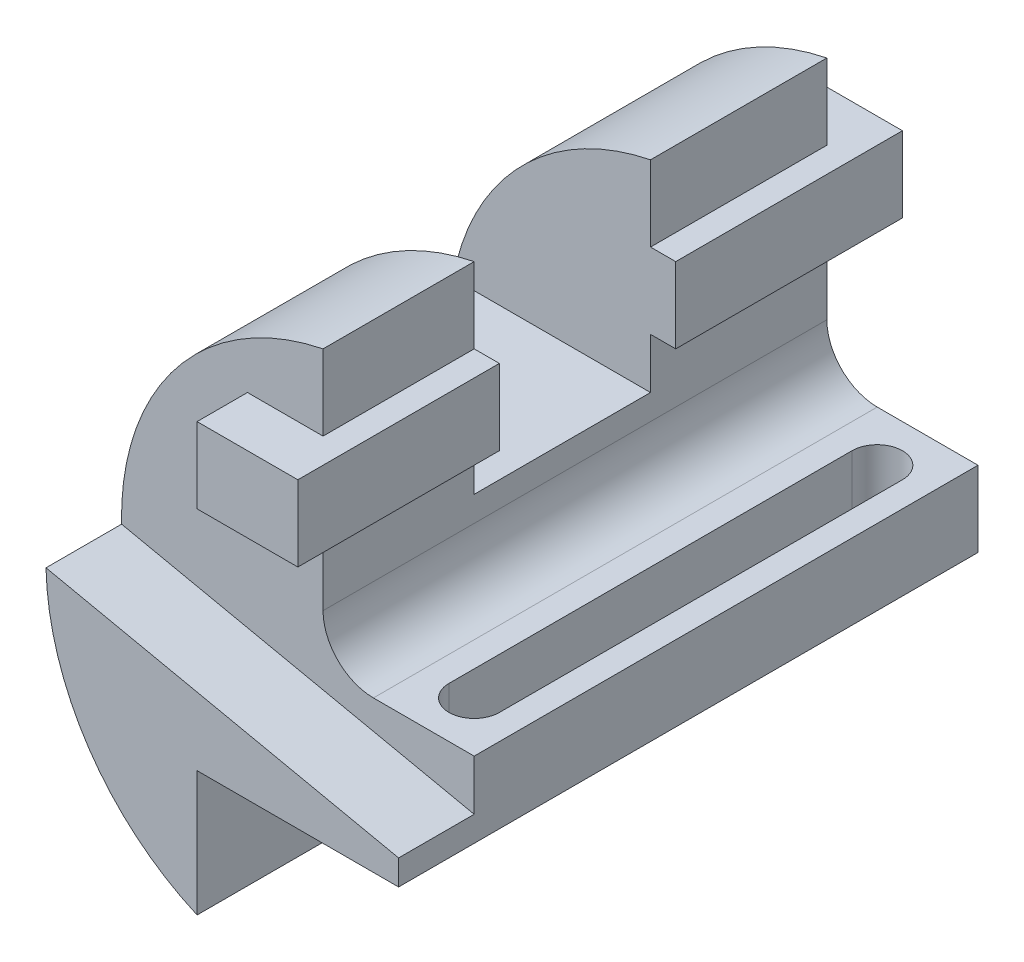
ISO-10303-21;
HEADER;
FILE_DESCRIPTION(('STEP AP214'),'2;1');
FILE_NAME('part.step','',(''),(''),'','','');
FILE_SCHEMA(('AUTOMOTIVE_DESIGN { 1 0 10303 214 1 1 1 1 }'));
ENDSEC;
DATA;
#1=APPLICATION_CONTEXT('core data for automotive mechanical design processes');
#2=APPLICATION_PROTOCOL_DEFINITION('international standard','automotive_design',2000,#1);
#3=PRODUCT_CONTEXT('',#1,'mechanical');
#4=PRODUCT('Part','Part','',(#3));
#5=PRODUCT_RELATED_PRODUCT_CATEGORY('part','',(#4));
#6=PRODUCT_DEFINITION_FORMATION('','',#4);
#7=PRODUCT_DEFINITION_CONTEXT('part definition',#1,'design');
#8=PRODUCT_DEFINITION('design','',#6,#7);
#9=PRODUCT_DEFINITION_SHAPE('','',#8);
#10=(LENGTH_UNIT() NAMED_UNIT(*) SI_UNIT(.MILLI.,.METRE.));
#11=(NAMED_UNIT(*) PLANE_ANGLE_UNIT() SI_UNIT($,.RADIAN.));
#12=(NAMED_UNIT(*) SI_UNIT($,.STERADIAN.) SOLID_ANGLE_UNIT());
#13=UNCERTAINTY_MEASURE_WITH_UNIT(LENGTH_MEASURE(1.E-05),#10,'distance_accuracy_value','');
#14=(GEOMETRIC_REPRESENTATION_CONTEXT(3) GLOBAL_UNCERTAINTY_ASSIGNED_CONTEXT((#13)) GLOBAL_UNIT_ASSIGNED_CONTEXT((#10,
#11,#12)) REPRESENTATION_CONTEXT('',''));
#15=CARTESIAN_POINT('',(0.,0.,0.));
#16=DIRECTION('',(0.,0.,1.));
#17=DIRECTION('',(1.,0.,0.));
#18=AXIS2_PLACEMENT_3D('',#15,#16,#17);
#19=CARTESIAN_POINT('',(-30.,15.,115.));
#20=DIRECTION('',(-1.,0.,0.));
#21=DIRECTION('',(0.,-1.,0.));
#22=AXIS2_PLACEMENT_3D('',#19,#20,#21);
#23=PLANE('',#22);
#24=DIRECTION('',(0.,0.,1.));
#25=VECTOR('',#24,1.);
#26=CARTESIAN_POINT('',(-30.,55.,115.));
#27=LINE('',#26,#25);
#28=CARTESIAN_POINT('',(-30.,55.,70.));
#29=VERTEX_POINT('',#28);
#30=CARTESIAN_POINT('',(-30.,55.,100.));
#31=VERTEX_POINT('',#30);
#32=EDGE_CURVE('E336',#29,#31,#27,.T.);
#33=ORIENTED_EDGE('',*,*,#32,.F.);
#34=DIRECTION('',(0.,1.,0.));
#35=VECTOR('',#34,1.);
#36=CARTESIAN_POINT('',(-30.,15.,70.));
#37=LINE('',#36,#35);
#38=CARTESIAN_POINT('',(-30.,70.,70.));
#39=VERTEX_POINT('',#38);
#40=EDGE_CURVE('E287',#29,#39,#37,.T.);
#41=ORIENTED_EDGE('',*,*,#40,.T.);
#42=DIRECTION('',(0.,0.,-1.));
#43=VECTOR('',#42,1.);
#44=CARTESIAN_POINT('',(-30.,70.,115.));
#45=LINE('',#44,#43);
#46=CARTESIAN_POINT('',(-30.,70.,100.));
#47=VERTEX_POINT('',#46);
#48=EDGE_CURVE('E401',#47,#39,#45,.T.);
#49=ORIENTED_EDGE('',*,*,#48,.F.);
#50=DIRECTION('',(0.,1.,0.));
#51=VECTOR('',#50,1.);
#52=CARTESIAN_POINT('',(-30.,15.,100.));
#53=LINE('',#52,#51);
#54=EDGE_CURVE('E355',#31,#47,#53,.T.);
#55=ORIENTED_EDGE('',*,*,#54,.F.);
#56=EDGE_LOOP('',(#33,#41,#49,#55));
#57=FACE_BOUND('',#56,.T.);
#58=ADVANCED_FACE('F41',(#57),#23,.F.);
#59=CARTESIAN_POINT('',(-25.,40.,-10.));
#60=DIRECTION('',(0.,1.,0.));
#61=DIRECTION('',(-1.,0.,0.));
#62=AXIS2_PLACEMENT_3D('',#59,#60,#61);
#63=PLANE('',#62);
#64=DIRECTION('',(0.,0.,-1.));
#65=VECTOR('',#64,1.);
#66=CARTESIAN_POINT('',(-30.,40.,115.));
#67=LINE('',#66,#65);
#68=CARTESIAN_POINT('',(-30.,40.,100.));
#69=VERTEX_POINT('',#68);
#70=CARTESIAN_POINT('',(-30.,40.,70.));
#71=VERTEX_POINT('',#70);
#72=EDGE_CURVE('E345',#69,#71,#67,.T.);
#73=ORIENTED_EDGE('',*,*,#72,.T.);
#74=DIRECTION('',(1.,0.,0.));
#75=VECTOR('',#74,1.);
#76=CARTESIAN_POINT('',(-25.,40.,70.));
#77=LINE('',#76,#75);
#78=CARTESIAN_POINT('',(-25.,40.,70.));
#79=VERTEX_POINT('',#78);
#80=EDGE_CURVE('E284',#71,#79,#77,.T.);
#81=ORIENTED_EDGE('',*,*,#80,.T.);
#82=DIRECTION('',(0.,0.,1.));
#83=VECTOR('',#82,1.);
#84=CARTESIAN_POINT('',(-25.,40.,-10.));
#85=LINE('',#84,#83);
#86=CARTESIAN_POINT('',(-25.,40.,110.));
#87=VERTEX_POINT('',#86);
#88=EDGE_CURVE('E332',#79,#87,#85,.T.);
#89=ORIENTED_EDGE('',*,*,#88,.T.);
#90=DIRECTION('',(-1.,0.,0.));
#91=VECTOR('',#90,1.);
#92=CARTESIAN_POINT('',(-25.,40.,110.));
#93=LINE('',#92,#91);
#94=CARTESIAN_POINT('',(-45.,40.,110.));
#95=VERTEX_POINT('',#94);
#96=EDGE_CURVE('E299',#87,#95,#93,.T.);
#97=ORIENTED_EDGE('',*,*,#96,.T.);
#98=DIRECTION('',(0.,0.,1.));
#99=VECTOR('',#98,1.);
#100=CARTESIAN_POINT('',(-45.,40.,-10.));
#101=LINE('',#100,#99);
#102=CARTESIAN_POINT('',(-45.,40.,100.));
#103=VERTEX_POINT('',#102);
#104=EDGE_CURVE('E328',#103,#95,#101,.T.);
#105=ORIENTED_EDGE('',*,*,#104,.F.);
#106=DIRECTION('',(-1.,0.,0.));
#107=VECTOR('',#106,1.);
#108=CARTESIAN_POINT('',(-20.,40.,100.));
#109=LINE('',#108,#107);
#110=EDGE_CURVE('E415',#69,#103,#109,.T.);
#111=ORIENTED_EDGE('',*,*,#110,.F.);
#112=EDGE_LOOP('',(#73,#81,#89,#97,#105,#111));
#113=FACE_BOUND('',#112,.T.);
#114=ADVANCED_FACE('F511',(#113),#63,.F.);
#115=CARTESIAN_POINT('',(-25.,55.,-10.));
#116=DIRECTION('',(0.,-1.,0.));
#117=DIRECTION('',(0.,0.,-1.));
#118=AXIS2_PLACEMENT_3D('',#115,#116,#117);
#119=PLANE('',#118);
#120=DIRECTION('',(0.,0.,1.));
#121=VECTOR('',#120,1.);
#122=CARTESIAN_POINT('',(-25.,55.,-10.));
#123=LINE('',#122,#121);
#124=CARTESIAN_POINT('',(-25.,55.,70.));
#125=VERTEX_POINT('',#124);
#126=CARTESIAN_POINT('',(-25.,55.,110.));
#127=VERTEX_POINT('',#126);
#128=EDGE_CURVE('E320',#125,#127,#123,.T.);
#129=ORIENTED_EDGE('',*,*,#128,.F.);
#130=DIRECTION('',(-1.,0.,0.));
#131=VECTOR('',#130,1.);
#132=CARTESIAN_POINT('',(-25.,55.,70.));
#133=LINE('',#132,#131);
#134=EDGE_CURVE('E281',#125,#29,#133,.T.);
#135=ORIENTED_EDGE('',*,*,#134,.T.);
#136=ORIENTED_EDGE('',*,*,#32,.T.);
#137=DIRECTION('',(1.,0.,0.));
#138=VECTOR('',#137,1.);
#139=CARTESIAN_POINT('',(-20.,55.,100.));
#140=LINE('',#139,#138);
#141=CARTESIAN_POINT('',(-45.,55.,100.));
#142=VERTEX_POINT('',#141);
#143=EDGE_CURVE('E409',#142,#31,#140,.T.);
#144=ORIENTED_EDGE('',*,*,#143,.F.);
#145=DIRECTION('',(0.,0.,1.));
#146=VECTOR('',#145,1.);
#147=CARTESIAN_POINT('',(-45.,55.,-10.));
#148=LINE('',#147,#146);
#149=CARTESIAN_POINT('',(-45.,55.,110.));
#150=VERTEX_POINT('',#149);
#151=EDGE_CURVE('E324',#142,#150,#148,.T.);
#152=ORIENTED_EDGE('',*,*,#151,.T.);
#153=DIRECTION('',(1.,0.,0.));
#154=VECTOR('',#153,1.);
#155=CARTESIAN_POINT('',(-25.,55.,110.));
#156=LINE('',#155,#154);
#157=EDGE_CURVE('E307',#150,#127,#156,.T.);
#158=ORIENTED_EDGE('',*,*,#157,.T.);
#159=EDGE_LOOP('',(#129,#135,#136,#144,#152,#158));
#160=FACE_BOUND('',#159,.T.);
#161=ADVANCED_FACE('F517',(#160),#119,.F.);
#162=CARTESIAN_POINT('',(-25.,55.,-10.));
#163=DIRECTION('',(-1.,0.,0.));
#164=DIRECTION('',(0.,-1.,0.));
#165=AXIS2_PLACEMENT_3D('',#162,#163,#164);
#166=PLANE('',#165);
#167=ORIENTED_EDGE('',*,*,#88,.F.);
#168=DIRECTION('',(0.,1.,0.));
#169=VECTOR('',#168,1.);
#170=CARTESIAN_POINT('',(-25.,55.,70.));
#171=LINE('',#170,#169);
#172=EDGE_CURVE('E421',#79,#125,#171,.T.);
#173=ORIENTED_EDGE('',*,*,#172,.T.);
#174=ORIENTED_EDGE('',*,*,#128,.T.);
#175=DIRECTION('',(0.,-1.,0.));
#176=VECTOR('',#175,1.);
#177=CARTESIAN_POINT('',(-25.,55.,110.));
#178=LINE('',#177,#176);
#179=EDGE_CURVE('E303',#127,#87,#178,.T.);
#180=ORIENTED_EDGE('',*,*,#179,.T.);
#181=EDGE_LOOP('',(#167,#173,#174,#180));
#182=FACE_BOUND('',#181,.T.);
#183=ADVANCED_FACE('F525',(#182),#166,.F.);
#184=CARTESIAN_POINT('',(-30.,25.,100.));
#185=VERTEX_POINT('',#184);
#186=EDGE_CURVE('E356',#185,#69,#53,.T.);
#187=ORIENTED_EDGE('',*,*,#186,.F.);
#188=DIRECTION('',(0.,0.,-1.));
#189=VECTOR('',#188,1.);
#190=CARTESIAN_POINT('',(-30.,25.,0.));
#191=LINE('',#190,#189);
#192=CARTESIAN_POINT('',(-30.,25.,0.));
#193=VERTEX_POINT('',#192);
#194=EDGE_CURVE('E436',#185,#193,#191,.T.);
#195=ORIENTED_EDGE('',*,*,#194,.T.);
#196=DIRECTION('',(0.,1.,0.));
#197=VECTOR('',#196,1.);
#198=CARTESIAN_POINT('',(-30.,15.,0.));
#199=LINE('',#198,#197);
#200=CARTESIAN_POINT('',(-30.,40.,0.));
#201=VERTEX_POINT('',#200);
#202=EDGE_CURVE('E390',#193,#201,#199,.T.);
#203=ORIENTED_EDGE('',*,*,#202,.T.);
#204=CARTESIAN_POINT('',(-30.,40.,35.));
#205=VERTEX_POINT('',#204);
#206=EDGE_CURVE('E344',#205,#201,#67,.T.);
#207=ORIENTED_EDGE('',*,*,#206,.F.);
#208=DIRECTION('',(0.,-1.,0.));
#209=VECTOR('',#208,1.);
#210=CARTESIAN_POINT('',(-30.,15.,35.));
#211=LINE('',#210,#209);
#212=CARTESIAN_POINT('',(-30.,30.,35.));
#213=VERTEX_POINT('',#212);
#214=EDGE_CURVE('E275',#205,#213,#211,.T.);
#215=ORIENTED_EDGE('',*,*,#214,.T.);
#216=DIRECTION('',(0.,0.,1.));
#217=VECTOR('',#216,1.);
#218=CARTESIAN_POINT('',(-30.,30.,115.));
#219=LINE('',#218,#217);
#220=CARTESIAN_POINT('',(-30.,30.,70.));
#221=VERTEX_POINT('',#220);
#222=EDGE_CURVE('E296',#213,#221,#219,.T.);
#223=ORIENTED_EDGE('',*,*,#222,.T.);
#224=DIRECTION('',(0.,1.,0.));
#225=VECTOR('',#224,1.);
#226=CARTESIAN_POINT('',(-30.,15.,70.));
#227=LINE('',#226,#225);
#228=EDGE_CURVE('E290',#221,#71,#227,.T.);
#229=ORIENTED_EDGE('',*,*,#228,.T.);
#230=ORIENTED_EDGE('',*,*,#72,.F.);
#231=EDGE_LOOP('',(#187,#195,#203,#207,#215,#223,#229,#230));
#232=FACE_BOUND('',#231,.T.);
#233=ADVANCED_FACE('F442',(#232),#23,.F.);
#234=CARTESIAN_POINT('',(-30.,70.,35.));
#235=VERTEX_POINT('',#234);
#236=CARTESIAN_POINT('',(-30.,70.,0.));
#237=VERTEX_POINT('',#236);
#238=EDGE_CURVE('E400',#235,#237,#45,.T.);
#239=ORIENTED_EDGE('',*,*,#238,.F.);
#240=DIRECTION('',(0.,-1.,0.));
#241=VECTOR('',#240,1.);
#242=CARTESIAN_POINT('',(-30.,15.,35.));
#243=LINE('',#242,#241);
#244=CARTESIAN_POINT('',(-30.,55.,35.));
#245=VERTEX_POINT('',#244);
#246=EDGE_CURVE('E272',#235,#245,#243,.T.);
#247=ORIENTED_EDGE('',*,*,#246,.T.);
#248=CARTESIAN_POINT('',(-30.,55.,0.));
#249=VERTEX_POINT('',#248);
#250=EDGE_CURVE('E337',#249,#245,#27,.T.);
#251=ORIENTED_EDGE('',*,*,#250,.F.);
#252=EDGE_CURVE('E389',#249,#237,#199,.T.);
#253=ORIENTED_EDGE('',*,*,#252,.T.);
#254=EDGE_LOOP('',(#239,#247,#251,#253));
#255=FACE_BOUND('',#254,.T.);
#256=ADVANCED_FACE('F476',(#255),#23,.F.);
#257=CARTESIAN_POINT('',(-20.,21.0102051443364,0.));
#258=DIRECTION('',(0.,0.,1.));
#259=DIRECTION('',(1.,0.,0.));
#260=AXIS2_PLACEMENT_3D('',#257,#258,#259);
#261=PLANE('',#260);
#262=DIRECTION('',(-1.,0.,0.));
#263=VECTOR('',#262,1.);
#264=CARTESIAN_POINT('',(-20.,40.,0.));
#265=LINE('',#264,#263);
#266=CARTESIAN_POINT('',(-45.,40.,0.));
#267=VERTEX_POINT('',#266);
#268=EDGE_CURVE('E348',#201,#267,#265,.T.);
#269=ORIENTED_EDGE('',*,*,#268,.F.);
#270=ORIENTED_EDGE('',*,*,#202,.F.);
#271=CARTESIAN_POINT('',(-20.,25.,0.));
#272=DIRECTION('',(0.,0.,1.));
#273=DIRECTION('',(1.,0.,0.));
#274=AXIS2_PLACEMENT_3D('',#271,#272,#273);
#275=CIRCLE('',#274,10.);
#276=CARTESIAN_POINT('',(-20.,15.,0.));
#277=VERTEX_POINT('',#276);
#278=EDGE_CURVE('E49',#193,#277,#275,.T.);
#279=ORIENTED_EDGE('',*,*,#278,.T.);
#280=DIRECTION('',(-1.,0.,0.));
#281=VECTOR('',#280,1.);
#282=CARTESIAN_POINT('',(0.,15.,0.));
#283=LINE('',#282,#281);
#284=CARTESIAN_POINT('',(0.,15.,0.));
#285=VERTEX_POINT('',#284);
#286=EDGE_CURVE('E387',#285,#277,#283,.T.);
#287=ORIENTED_EDGE('',*,*,#286,.F.);
#288=DIRECTION('',(0.,1.,0.));
#289=VECTOR('',#288,1.);
#290=CARTESIAN_POINT('',(0.,0.,0.));
#291=LINE('',#290,#289);
#292=CARTESIAN_POINT('',(0.,0.,0.));
#293=VERTEX_POINT('',#292);
#294=EDGE_CURVE('E384',#293,#285,#291,.T.);
#295=ORIENTED_EDGE('',*,*,#294,.F.);
#296=DIRECTION('',(1.,0.,0.));
#297=VECTOR('',#296,1.);
#298=CARTESIAN_POINT('',(0.,0.,0.));
#299=LINE('',#298,#297);
#300=CARTESIAN_POINT('',(-40.,0.,0.));
#301=VERTEX_POINT('',#300);
#302=EDGE_CURVE('E368',#301,#293,#299,.T.);
#303=ORIENTED_EDGE('',*,*,#302,.F.);
#304=DIRECTION('',(0.,1.,0.));
#305=VECTOR('',#304,1.);
#306=CARTESIAN_POINT('',(-40.,0.,0.));
#307=LINE('',#306,#305);
#308=CARTESIAN_POINT('',(-40.,-24.8155518052219,0.));
#309=VERTEX_POINT('',#308);
#310=EDGE_CURVE('E374',#309,#301,#307,.T.);
#311=ORIENTED_EDGE('',*,*,#310,.F.);
#312=CARTESIAN_POINT('',(-20.,21.0102051443364,0.));
#313=DIRECTION('',(0.,0.,1.));
#314=DIRECTION('',(1.,0.,0.));
#315=AXIS2_PLACEMENT_3D('',#312,#313,#314);
#316=CIRCLE('',#315,50.);
#317=EDGE_CURVE('E392',#237,#309,#316,.T.);
#318=ORIENTED_EDGE('',*,*,#317,.F.);
#319=ORIENTED_EDGE('',*,*,#252,.F.);
#320=DIRECTION('',(1.,0.,0.));
#321=VECTOR('',#320,1.);
#322=CARTESIAN_POINT('',(-20.,55.,0.));
#323=LINE('',#322,#321);
#324=CARTESIAN_POINT('',(-45.,55.,0.));
#325=VERTEX_POINT('',#324);
#326=EDGE_CURVE('E340',#325,#249,#323,.T.);
#327=ORIENTED_EDGE('',*,*,#326,.F.);
#328=DIRECTION('',(0.,1.,0.));
#329=VECTOR('',#328,1.);
#330=CARTESIAN_POINT('',(-45.,21.0102051443365,0.));
#331=LINE('',#330,#329);
#332=EDGE_CURVE('E342',#267,#325,#331,.T.);
#333=ORIENTED_EDGE('',*,*,#332,.F.);
#334=EDGE_LOOP('',(#269,#270,#279,#287,#295,#303,#311,#318,#319,#327,#333));
#335=FACE_BOUND('',#334,.T.);
#336=ADVANCED_FACE('F449',(#335),#261,.F.);
#337=CARTESIAN_POINT('',(-20.,21.0102051443364,100.));
#338=DIRECTION('',(0.,0.,1.));
#339=DIRECTION('',(1.,0.,0.));
#340=AXIS2_PLACEMENT_3D('',#337,#338,#339);
#341=PLANE('',#340);
#342=DIRECTION('',(-1.,0.,0.));
#343=VECTOR('',#342,1.);
#344=CARTESIAN_POINT('',(0.,15.,100.));
#345=LINE('',#344,#343);
#346=CARTESIAN_POINT('',(0.,15.,100.));
#347=VERTEX_POINT('',#346);
#348=CARTESIAN_POINT('',(-20.,15.,100.));
#349=VERTEX_POINT('',#348);
#350=EDGE_CURVE('E353',#347,#349,#345,.T.);
#351=ORIENTED_EDGE('',*,*,#350,.T.);
#352=CARTESIAN_POINT('',(-20.,25.,100.));
#353=DIRECTION('',(0.,0.,1.));
#354=DIRECTION('',(1.,0.,0.));
#355=AXIS2_PLACEMENT_3D('',#352,#353,#354);
#356=CIRCLE('',#355,10.);
#357=EDGE_CURVE('E12',#349,#185,#356,.F.);
#358=ORIENTED_EDGE('',*,*,#357,.T.);
#359=ORIENTED_EDGE('',*,*,#186,.T.);
#360=ORIENTED_EDGE('',*,*,#110,.T.);
#361=DIRECTION('',(0.,1.,0.));
#362=VECTOR('',#361,1.);
#363=CARTESIAN_POINT('',(-45.,21.0102051443365,100.));
#364=LINE('',#363,#362);
#365=EDGE_CURVE('E412',#103,#142,#364,.T.);
#366=ORIENTED_EDGE('',*,*,#365,.T.);
#367=ORIENTED_EDGE('',*,*,#143,.T.);
#368=ORIENTED_EDGE('',*,*,#54,.T.);
#369=CARTESIAN_POINT('',(-20.,21.0102051443364,100.));
#370=DIRECTION('',(0.,0.,1.));
#371=DIRECTION('',(1.,0.,0.));
#372=AXIS2_PLACEMENT_3D('',#369,#370,#371);
#373=CIRCLE('',#372,50.);
#374=CARTESIAN_POINT('',(-69.987139251767,19.8762256804764,100.));
#375=VERTEX_POINT('',#374);
#376=EDGE_CURVE('E358',#47,#375,#373,.T.);
#377=ORIENTED_EDGE('',*,*,#376,.T.);
#378=DIRECTION('',(0.978147600733806,-0.207911690817756,0.));
#379=VECTOR('',#378,1.);
#380=CARTESIAN_POINT('',(0.,5.,100.));
#381=LINE('',#380,#379);
#382=CARTESIAN_POINT('',(0.,5.,100.));
#383=VERTEX_POINT('',#382);
#384=EDGE_CURVE('E360',#375,#383,#381,.T.);
#385=ORIENTED_EDGE('',*,*,#384,.T.);
#386=DIRECTION('',(0.,1.,0.));
#387=VECTOR('',#386,1.);
#388=CARTESIAN_POINT('',(0.,5.,100.));
#389=LINE('',#388,#387);
#390=EDGE_CURVE('E351',#383,#347,#389,.T.);
#391=ORIENTED_EDGE('',*,*,#390,.T.);
#392=EDGE_LOOP('',(#351,#358,#359,#360,#366,#367,#368,#377,#385,#391));
#393=FACE_BOUND('',#392,.T.);
#394=ADVANCED_FACE('F501',(#393),#341,.T.);
#395=CARTESIAN_POINT('',(0.,15.,115.));
#396=DIRECTION('',(0.,-1.,0.));
#397=DIRECTION('',(1.,0.,0.));
#398=AXIS2_PLACEMENT_3D('',#395,#396,#397);
#399=PLANE('',#398);
#400=DIRECTION('',(0.,0.,1.));
#401=VECTOR('',#400,1.);
#402=CARTESIAN_POINT('',(-15.,15.,10.));
#403=LINE('',#402,#401);
#404=CARTESIAN_POINT('',(-15.,15.,10.));
#405=VERTEX_POINT('',#404);
#406=CARTESIAN_POINT('',(-15.,15.,90.));
#407=VERTEX_POINT('',#406);
#408=EDGE_CURVE('E242',#405,#407,#403,.T.);
#409=ORIENTED_EDGE('',*,*,#408,.F.);
#410=CARTESIAN_POINT('',(-10.,15.,10.));
#411=DIRECTION('',(0.,1.,0.));
#412=DIRECTION('',(-1.,0.,0.));
#413=AXIS2_PLACEMENT_3D('',#410,#411,#412);
#414=CIRCLE('',#413,5.);
#415=CARTESIAN_POINT('',(-5.,15.,10.));
#416=VERTEX_POINT('',#415);
#417=EDGE_CURVE('E247',#416,#405,#414,.T.);
#418=ORIENTED_EDGE('',*,*,#417,.F.);
#419=DIRECTION('',(0.,0.,-1.));
#420=VECTOR('',#419,1.);
#421=CARTESIAN_POINT('',(-5.,15.,10.));
#422=LINE('',#421,#420);
#423=CARTESIAN_POINT('',(-5.00000000000001,15.,90.));
#424=VERTEX_POINT('',#423);
#425=EDGE_CURVE('E251',#424,#416,#422,.T.);
#426=ORIENTED_EDGE('',*,*,#425,.F.);
#427=CARTESIAN_POINT('',(-10.,15.,90.));
#428=DIRECTION('',(0.,1.,0.));
#429=DIRECTION('',(-1.,0.,0.));
#430=AXIS2_PLACEMENT_3D('',#427,#428,#429);
#431=CIRCLE('',#430,5.);
#432=EDGE_CURVE('E231',#407,#424,#431,.T.);
#433=ORIENTED_EDGE('',*,*,#432,.F.);
#434=EDGE_LOOP('',(#409,#418,#426,#433));
#435=FACE_BOUND('',#434,.T.);
#436=ORIENTED_EDGE('',*,*,#286,.T.);
#437=DIRECTION('',(0.,0.,-1.));
#438=VECTOR('',#437,1.);
#439=CARTESIAN_POINT('',(-20.,15.,100.));
#440=LINE('',#439,#438);
#441=EDGE_CURVE('E62',#277,#349,#440,.F.);
#442=ORIENTED_EDGE('',*,*,#441,.T.);
#443=ORIENTED_EDGE('',*,*,#350,.F.);
#444=DIRECTION('',(0.,0.,-1.));
#445=VECTOR('',#444,1.);
#446=CARTESIAN_POINT('',(0.,15.,115.));
#447=LINE('',#446,#445);
#448=EDGE_CURVE('E404',#347,#285,#447,.T.);
#449=ORIENTED_EDGE('',*,*,#448,.T.);
#450=EDGE_LOOP('',(#436,#442,#443,#449));
#451=FACE_BOUND('',#450,.T.);
#452=ADVANCED_FACE('F249',(#435,#451),#399,.F.);
#453=CARTESIAN_POINT('',(0.,0.,115.));
#454=DIRECTION('',(0.,1.,0.));
#455=DIRECTION('',(-1.,0.,0.));
#456=AXIS2_PLACEMENT_3D('',#453,#454,#455);
#457=PLANE('',#456);
#458=DIRECTION('',(0.,0.,-1.));
#459=VECTOR('',#458,1.);
#460=CARTESIAN_POINT('',(-5.00000000000001,0.,115.));
#461=LINE('',#460,#459);
#462=CARTESIAN_POINT('',(-5.00000000000001,0.,90.));
#463=VERTEX_POINT('',#462);
#464=CARTESIAN_POINT('',(-5.,0.,10.));
#465=VERTEX_POINT('',#464);
#466=EDGE_CURVE('E430',#463,#465,#461,.T.);
#467=ORIENTED_EDGE('',*,*,#466,.T.);
#468=CARTESIAN_POINT('',(-10.,0.,10.));
#469=DIRECTION('',(0.,1.,0.));
#470=DIRECTION('',(-1.,0.,0.));
#471=AXIS2_PLACEMENT_3D('',#468,#469,#470);
#472=CIRCLE('',#471,5.);
#473=CARTESIAN_POINT('',(-15.,0.,10.));
#474=VERTEX_POINT('',#473);
#475=EDGE_CURVE('E433',#465,#474,#472,.T.);
#476=ORIENTED_EDGE('',*,*,#475,.T.);
#477=DIRECTION('',(0.,0.,1.));
#478=VECTOR('',#477,1.);
#479=CARTESIAN_POINT('',(-15.,0.,115.));
#480=LINE('',#479,#478);
#481=CARTESIAN_POINT('',(-15.,0.,90.));
#482=VERTEX_POINT('',#481);
#483=EDGE_CURVE('E427',#474,#482,#480,.T.);
#484=ORIENTED_EDGE('',*,*,#483,.T.);
#485=CARTESIAN_POINT('',(-10.,0.,90.));
#486=DIRECTION('',(0.,1.,0.));
#487=DIRECTION('',(-1.,0.,0.));
#488=AXIS2_PLACEMENT_3D('',#485,#486,#487);
#489=CIRCLE('',#488,5.);
#490=EDGE_CURVE('E234',#482,#463,#489,.T.);
#491=ORIENTED_EDGE('',*,*,#490,.T.);
#492=EDGE_LOOP('',(#467,#476,#484,#491));
#493=FACE_BOUND('',#492,.T.);
#494=ORIENTED_EDGE('',*,*,#302,.T.);
#495=DIRECTION('',(0.,0.,-1.));
#496=VECTOR('',#495,1.);
#497=CARTESIAN_POINT('',(0.,0.,115.));
#498=LINE('',#497,#496);
#499=CARTESIAN_POINT('',(0.,0.,115.));
#500=VERTEX_POINT('',#499);
#501=EDGE_CURVE('E406',#500,#293,#498,.T.);
#502=ORIENTED_EDGE('',*,*,#501,.F.);
#503=DIRECTION('',(1.,0.,0.));
#504=VECTOR('',#503,1.);
#505=CARTESIAN_POINT('',(0.,0.,115.));
#506=LINE('',#505,#504);
#507=CARTESIAN_POINT('',(-40.,0.,115.));
#508=VERTEX_POINT('',#507);
#509=EDGE_CURVE('E370',#508,#500,#506,.T.);
#510=ORIENTED_EDGE('',*,*,#509,.F.);
#511=DIRECTION('',(0.,0.,-1.));
#512=VECTOR('',#511,1.);
#513=CARTESIAN_POINT('',(-40.,0.,115.));
#514=LINE('',#513,#512);
#515=EDGE_CURVE('E381',#508,#301,#514,.T.);
#516=ORIENTED_EDGE('',*,*,#515,.T.);
#517=EDGE_LOOP('',(#494,#502,#510,#516));
#518=FACE_BOUND('',#517,.T.);
#519=ADVANCED_FACE('F568',(#493,#518),#457,.F.);
#520=CARTESIAN_POINT('',(0.,0.,115.));
#521=DIRECTION('',(-1.,0.,0.));
#522=DIRECTION('',(0.,0.,1.));
#523=AXIS2_PLACEMENT_3D('',#520,#521,#522);
#524=PLANE('',#523);
#525=ORIENTED_EDGE('',*,*,#390,.F.);
#526=DIRECTION('',(0.,0.,1.));
#527=VECTOR('',#526,1.);
#528=CARTESIAN_POINT('',(0.,5.,100.));
#529=LINE('',#528,#527);
#530=CARTESIAN_POINT('',(0.,5.,115.));
#531=VERTEX_POINT('',#530);
#532=EDGE_CURVE('E365',#383,#531,#529,.T.);
#533=ORIENTED_EDGE('',*,*,#532,.T.);
#534=DIRECTION('',(0.,1.,0.));
#535=VECTOR('',#534,1.);
#536=CARTESIAN_POINT('',(0.,0.,115.));
#537=LINE('',#536,#535);
#538=EDGE_CURVE('E373',#500,#531,#537,.T.);
#539=ORIENTED_EDGE('',*,*,#538,.F.);
#540=ORIENTED_EDGE('',*,*,#501,.T.);
#541=ORIENTED_EDGE('',*,*,#294,.T.);
#542=ORIENTED_EDGE('',*,*,#448,.F.);
#543=EDGE_LOOP('',(#525,#533,#539,#540,#541,#542));
#544=FACE_BOUND('',#543,.T.);
#545=ADVANCED_FACE('F504',(#544),#524,.F.);
#546=CARTESIAN_POINT('',(-20.,21.0102051443364,115.));
#547=DIRECTION('',(0.,0.,-1.));
#548=DIRECTION('',(-1.,0.,0.));
#549=AXIS2_PLACEMENT_3D('',#546,#547,#548);
#550=CYLINDRICAL_SURFACE('',#549,50.);
#551=ORIENTED_EDGE('',*,*,#48,.T.);
#552=CARTESIAN_POINT('',(-20.,21.0102051443364,70.));
#553=DIRECTION('',(0.,0.,1.));
#554=DIRECTION('',(1.,0.,0.));
#555=AXIS2_PLACEMENT_3D('',#552,#553,#554);
#556=CIRCLE('',#555,50.);
#557=CARTESIAN_POINT('',(-69.185196842679,30.,70.));
#558=VERTEX_POINT('',#557);
#559=EDGE_CURVE('E293',#39,#558,#556,.T.);
#560=ORIENTED_EDGE('',*,*,#559,.T.);
#561=DIRECTION('',(0.,0.,-1.));
#562=VECTOR('',#561,1.);
#563=CARTESIAN_POINT('',(-69.185196842679,30.,115.));
#564=LINE('',#563,#562);
#565=CARTESIAN_POINT('',(-69.185196842679,30.,35.));
#566=VERTEX_POINT('',#565);
#567=EDGE_CURVE('E424',#558,#566,#564,.T.);
#568=ORIENTED_EDGE('',*,*,#567,.T.);
#569=CARTESIAN_POINT('',(-20.,21.0102051443364,35.));
#570=DIRECTION('',(0.,0.,-1.));
#571=DIRECTION('',(-1.,0.,0.));
#572=AXIS2_PLACEMENT_3D('',#569,#570,#571);
#573=CIRCLE('',#572,50.);
#574=EDGE_CURVE('E278',#566,#235,#573,.T.);
#575=ORIENTED_EDGE('',*,*,#574,.T.);
#576=ORIENTED_EDGE('',*,*,#238,.T.);
#577=ORIENTED_EDGE('',*,*,#317,.T.);
#578=DIRECTION('',(0.,0.,-1.));
#579=VECTOR('',#578,1.);
#580=CARTESIAN_POINT('',(-40.,-24.8155518052219,115.));
#581=LINE('',#580,#579);
#582=CARTESIAN_POINT('',(-40.,-24.8155518052219,115.));
#583=VERTEX_POINT('',#582);
#584=EDGE_CURVE('E397',#583,#309,#581,.T.);
#585=ORIENTED_EDGE('',*,*,#584,.F.);
#586=CARTESIAN_POINT('',(-20.,21.0102051443364,115.));
#587=DIRECTION('',(0.,0.,1.));
#588=DIRECTION('',(1.,0.,0.));
#589=AXIS2_PLACEMENT_3D('',#586,#587,#588);
#590=CIRCLE('',#589,50.);
#591=CARTESIAN_POINT('',(-69.987139251767,19.8762256804764,115.));
#592=VERTEX_POINT('',#591);
#593=EDGE_CURVE('E377',#592,#583,#590,.T.);
#594=ORIENTED_EDGE('',*,*,#593,.F.);
#595=DIRECTION('',(0.,0.,1.));
#596=VECTOR('',#595,1.);
#597=CARTESIAN_POINT('',(-69.987139251767,19.8762256804764,100.));
#598=LINE('',#597,#596);
#599=EDGE_CURVE('E363',#375,#592,#598,.T.);
#600=ORIENTED_EDGE('',*,*,#599,.F.);
#601=ORIENTED_EDGE('',*,*,#376,.F.);
#602=EDGE_LOOP('',(#551,#560,#568,#575,#576,#577,#585,#594,#600,#601));
#603=FACE_BOUND('',#602,.T.);
#604=ADVANCED_FACE('F482',(#603),#550,.T.);
#605=CARTESIAN_POINT('',(-40.,0.,115.));
#606=DIRECTION('',(-1.,0.,0.));
#607=DIRECTION('',(0.,-1.,0.));
#608=AXIS2_PLACEMENT_3D('',#605,#606,#607);
#609=PLANE('',#608);
#610=ORIENTED_EDGE('',*,*,#310,.T.);
#611=ORIENTED_EDGE('',*,*,#515,.F.);
#612=DIRECTION('',(0.,1.,0.));
#613=VECTOR('',#612,1.);
#614=CARTESIAN_POINT('',(-40.,0.,115.));
#615=LINE('',#614,#613);
#616=EDGE_CURVE('E379',#583,#508,#615,.T.);
#617=ORIENTED_EDGE('',*,*,#616,.F.);
#618=ORIENTED_EDGE('',*,*,#584,.T.);
#619=EDGE_LOOP('',(#610,#611,#617,#618));
#620=FACE_BOUND('',#619,.T.);
#621=ADVANCED_FACE('F486',(#620),#609,.F.);
#622=CARTESIAN_POINT('',(-20.,21.0102051443364,115.));
#623=DIRECTION('',(0.,0.,1.));
#624=DIRECTION('',(1.,0.,0.));
#625=AXIS2_PLACEMENT_3D('',#622,#623,#624);
#626=PLANE('',#625);
#627=DIRECTION('',(0.978147600733806,-0.207911690817756,0.));
#628=VECTOR('',#627,1.);
#629=CARTESIAN_POINT('',(0.,5.,115.));
#630=LINE('',#629,#628);
#631=EDGE_CURVE('E350',#592,#531,#630,.T.);
#632=ORIENTED_EDGE('',*,*,#631,.F.);
#633=ORIENTED_EDGE('',*,*,#593,.T.);
#634=ORIENTED_EDGE('',*,*,#616,.T.);
#635=ORIENTED_EDGE('',*,*,#509,.T.);
#636=ORIENTED_EDGE('',*,*,#538,.T.);
#637=EDGE_LOOP('',(#632,#633,#634,#635,#636));
#638=FACE_BOUND('',#637,.T.);
#639=ADVANCED_FACE('F491',(#638),#626,.T.);
#640=CARTESIAN_POINT('',(0.,5.,100.));
#641=DIRECTION('',(-0.207911690817756,-0.978147600733806,0.));
#642=DIRECTION('',(0.978147600733806,-0.207911690817756,0.));
#643=AXIS2_PLACEMENT_3D('',#640,#641,#642);
#644=PLANE('',#643);
#645=ORIENTED_EDGE('',*,*,#631,.T.);
#646=ORIENTED_EDGE('',*,*,#532,.F.);
#647=ORIENTED_EDGE('',*,*,#384,.F.);
#648=ORIENTED_EDGE('',*,*,#599,.T.);
#649=EDGE_LOOP('',(#645,#646,#647,#648));
#650=FACE_BOUND('',#649,.T.);
#651=ADVANCED_FACE('F498',(#650),#644,.F.);
#652=CARTESIAN_POINT('',(-25.,40.,-10.));
#653=VERTEX_POINT('',#652);
#654=CARTESIAN_POINT('',(-25.,40.,35.));
#655=VERTEX_POINT('',#654);
#656=EDGE_CURVE('E333',#653,#655,#85,.T.);
#657=ORIENTED_EDGE('',*,*,#656,.T.);
#658=DIRECTION('',(-1.,0.,0.));
#659=VECTOR('',#658,1.);
#660=CARTESIAN_POINT('',(-25.,40.,35.));
#661=LINE('',#660,#659);
#662=EDGE_CURVE('E269',#655,#205,#661,.T.);
#663=ORIENTED_EDGE('',*,*,#662,.T.);
#664=ORIENTED_EDGE('',*,*,#206,.T.);
#665=ORIENTED_EDGE('',*,*,#268,.T.);
#666=CARTESIAN_POINT('',(-45.,40.,-10.));
#667=VERTEX_POINT('',#666);
#668=EDGE_CURVE('E329',#667,#267,#101,.T.);
#669=ORIENTED_EDGE('',*,*,#668,.F.);
#670=DIRECTION('',(-1.,0.,0.));
#671=VECTOR('',#670,1.);
#672=CARTESIAN_POINT('',(-25.,40.,-10.));
#673=LINE('',#672,#671);
#674=EDGE_CURVE('E314',#653,#667,#673,.T.);
#675=ORIENTED_EDGE('',*,*,#674,.F.);
#676=EDGE_LOOP('',(#657,#663,#664,#665,#669,#675));
#677=FACE_BOUND('',#676,.T.);
#678=ADVANCED_FACE('F454',(#677),#63,.F.);
#679=CARTESIAN_POINT('',(-45.,55.,-10.));
#680=DIRECTION('',(1.,0.,0.));
#681=DIRECTION('',(0.,1.,0.));
#682=AXIS2_PLACEMENT_3D('',#679,#680,#681);
#683=PLANE('',#682);
#684=ORIENTED_EDGE('',*,*,#668,.T.);
#685=ORIENTED_EDGE('',*,*,#332,.T.);
#686=CARTESIAN_POINT('',(-45.,55.,-10.));
#687=VERTEX_POINT('',#686);
#688=EDGE_CURVE('E325',#687,#325,#148,.T.);
#689=ORIENTED_EDGE('',*,*,#688,.F.);
#690=DIRECTION('',(0.,1.,0.));
#691=VECTOR('',#690,1.);
#692=CARTESIAN_POINT('',(-45.,55.,-10.));
#693=LINE('',#692,#691);
#694=EDGE_CURVE('E316',#667,#687,#693,.T.);
#695=ORIENTED_EDGE('',*,*,#694,.F.);
#696=EDGE_LOOP('',(#684,#685,#689,#695));
#697=FACE_BOUND('',#696,.T.);
#698=ADVANCED_FACE('F457',(#697),#683,.F.);
#699=ORIENTED_EDGE('',*,*,#250,.T.);
#700=DIRECTION('',(1.,0.,0.));
#701=VECTOR('',#700,1.);
#702=CARTESIAN_POINT('',(-25.,55.,35.));
#703=LINE('',#702,#701);
#704=CARTESIAN_POINT('',(-25.,55.,35.));
#705=VERTEX_POINT('',#704);
#706=EDGE_CURVE('E264',#245,#705,#703,.T.);
#707=ORIENTED_EDGE('',*,*,#706,.T.);
#708=CARTESIAN_POINT('',(-25.,55.,-10.));
#709=VERTEX_POINT('',#708);
#710=EDGE_CURVE('E321',#709,#705,#123,.T.);
#711=ORIENTED_EDGE('',*,*,#710,.F.);
#712=DIRECTION('',(1.,0.,0.));
#713=VECTOR('',#712,1.);
#714=CARTESIAN_POINT('',(-25.,55.,-10.));
#715=LINE('',#714,#713);
#716=EDGE_CURVE('E318',#687,#709,#715,.T.);
#717=ORIENTED_EDGE('',*,*,#716,.F.);
#718=ORIENTED_EDGE('',*,*,#688,.T.);
#719=ORIENTED_EDGE('',*,*,#326,.T.);
#720=EDGE_LOOP('',(#699,#707,#711,#717,#718,#719));
#721=FACE_BOUND('',#720,.T.);
#722=ADVANCED_FACE('F470',(#721),#119,.F.);
#723=ORIENTED_EDGE('',*,*,#710,.T.);
#724=DIRECTION('',(0.,-1.,0.));
#725=VECTOR('',#724,1.);
#726=CARTESIAN_POINT('',(-25.,55.,35.));
#727=LINE('',#726,#725);
#728=EDGE_CURVE('E418',#705,#655,#727,.T.);
#729=ORIENTED_EDGE('',*,*,#728,.T.);
#730=ORIENTED_EDGE('',*,*,#656,.F.);
#731=DIRECTION('',(0.,-1.,0.));
#732=VECTOR('',#731,1.);
#733=CARTESIAN_POINT('',(-25.,55.,-10.));
#734=LINE('',#733,#732);
#735=EDGE_CURVE('E306',#709,#653,#734,.T.);
#736=ORIENTED_EDGE('',*,*,#735,.F.);
#737=EDGE_LOOP('',(#723,#729,#730,#736));
#738=FACE_BOUND('',#737,.T.);
#739=ADVANCED_FACE('F466',(#738),#166,.F.);
#740=ORIENTED_EDGE('',*,*,#365,.F.);
#741=ORIENTED_EDGE('',*,*,#104,.T.);
#742=DIRECTION('',(0.,1.,0.));
#743=VECTOR('',#742,1.);
#744=CARTESIAN_POINT('',(-45.,55.,110.));
#745=LINE('',#744,#743);
#746=EDGE_CURVE('E302',#95,#150,#745,.T.);
#747=ORIENTED_EDGE('',*,*,#746,.T.);
#748=ORIENTED_EDGE('',*,*,#151,.F.);
#749=EDGE_LOOP('',(#740,#741,#747,#748));
#750=FACE_BOUND('',#749,.T.);
#751=ADVANCED_FACE('F539',(#750),#683,.F.);
#752=CARTESIAN_POINT('',(0.,0.,-10.));
#753=DIRECTION('',(0.,0.,-1.));
#754=DIRECTION('',(-1.,0.,0.));
#755=AXIS2_PLACEMENT_3D('',#752,#753,#754);
#756=PLANE('',#755);
#757=ORIENTED_EDGE('',*,*,#735,.T.);
#758=ORIENTED_EDGE('',*,*,#674,.T.);
#759=ORIENTED_EDGE('',*,*,#694,.T.);
#760=ORIENTED_EDGE('',*,*,#716,.T.);
#761=EDGE_LOOP('',(#757,#758,#759,#760));
#762=FACE_BOUND('',#761,.T.);
#763=ADVANCED_FACE('F461',(#762),#756,.T.);
#764=CARTESIAN_POINT('',(-20.,21.0102051443364,110.));
#765=DIRECTION('',(0.,0.,1.));
#766=DIRECTION('',(1.,0.,0.));
#767=AXIS2_PLACEMENT_3D('',#764,#765,#766);
#768=PLANE('',#767);
#769=ORIENTED_EDGE('',*,*,#179,.F.);
#770=ORIENTED_EDGE('',*,*,#157,.F.);
#771=ORIENTED_EDGE('',*,*,#746,.F.);
#772=ORIENTED_EDGE('',*,*,#96,.F.);
#773=EDGE_LOOP('',(#769,#770,#771,#772));
#774=FACE_BOUND('',#773,.T.);
#775=ADVANCED_FACE('F623',(#774),#768,.T.);
#776=CARTESIAN_POINT('',(-70.,30.,70.));
#777=DIRECTION('',(0.,-1.,0.));
#778=DIRECTION('',(1.,0.,0.));
#779=AXIS2_PLACEMENT_3D('',#776,#777,#778);
#780=PLANE('',#779);
#781=DIRECTION('',(1.,0.,0.));
#782=VECTOR('',#781,1.);
#783=CARTESIAN_POINT('',(-70.,30.,35.));
#784=LINE('',#783,#782);
#785=EDGE_CURVE('E261',#566,#213,#784,.T.);
#786=ORIENTED_EDGE('',*,*,#785,.F.);
#787=ORIENTED_EDGE('',*,*,#567,.F.);
#788=DIRECTION('',(1.,0.,0.));
#789=VECTOR('',#788,1.);
#790=CARTESIAN_POINT('',(-70.,30.,70.));
#791=LINE('',#790,#789);
#792=EDGE_CURVE('E258',#558,#221,#791,.T.);
#793=ORIENTED_EDGE('',*,*,#792,.T.);
#794=ORIENTED_EDGE('',*,*,#222,.F.);
#795=EDGE_LOOP('',(#786,#787,#793,#794));
#796=FACE_BOUND('',#795,.T.);
#797=ADVANCED_FACE('F617',(#796),#780,.F.);
#798=CARTESIAN_POINT('',(-70.,70.,70.));
#799=DIRECTION('',(0.,0.,1.));
#800=DIRECTION('',(1.,0.,0.));
#801=AXIS2_PLACEMENT_3D('',#798,#799,#800);
#802=PLANE('',#801);
#803=ORIENTED_EDGE('',*,*,#40,.F.);
#804=ORIENTED_EDGE('',*,*,#134,.F.);
#805=ORIENTED_EDGE('',*,*,#172,.F.);
#806=ORIENTED_EDGE('',*,*,#80,.F.);
#807=ORIENTED_EDGE('',*,*,#228,.F.);
#808=ORIENTED_EDGE('',*,*,#792,.F.);
#809=ORIENTED_EDGE('',*,*,#559,.F.);
#810=EDGE_LOOP('',(#803,#804,#805,#806,#807,#808,#809));
#811=FACE_BOUND('',#810,.T.);
#812=ADVANCED_FACE('F622',(#811),#802,.F.);
#813=CARTESIAN_POINT('',(-70.,70.,35.));
#814=DIRECTION('',(0.,0.,-1.));
#815=DIRECTION('',(-1.,0.,0.));
#816=AXIS2_PLACEMENT_3D('',#813,#814,#815);
#817=PLANE('',#816);
#818=ORIENTED_EDGE('',*,*,#785,.T.);
#819=ORIENTED_EDGE('',*,*,#214,.F.);
#820=ORIENTED_EDGE('',*,*,#662,.F.);
#821=ORIENTED_EDGE('',*,*,#728,.F.);
#822=ORIENTED_EDGE('',*,*,#706,.F.);
#823=ORIENTED_EDGE('',*,*,#246,.F.);
#824=ORIENTED_EDGE('',*,*,#574,.F.);
#825=EDGE_LOOP('',(#818,#819,#820,#821,#822,#823,#824));
#826=FACE_BOUND('',#825,.T.);
#827=ADVANCED_FACE('F468',(#826),#817,.F.);
#828=CARTESIAN_POINT('',(-9.99999999999999,-24.8155518052219,10.));
#829=DIRECTION('',(0.,1.,0.));
#830=DIRECTION('',(-1.,0.,0.));
#831=AXIS2_PLACEMENT_3D('',#828,#829,#830);
#832=CYLINDRICAL_SURFACE('',#831,5.);
#833=DIRECTION('',(0.,1.,0.));
#834=VECTOR('',#833,1.);
#835=CARTESIAN_POINT('',(-4.99999999999999,-24.8155518052219,10.));
#836=LINE('',#835,#834);
#837=EDGE_CURVE('E256',#465,#416,#836,.T.);
#838=ORIENTED_EDGE('',*,*,#837,.T.);
#839=ORIENTED_EDGE('',*,*,#417,.T.);
#840=DIRECTION('',(0.,1.,0.));
#841=VECTOR('',#840,1.);
#842=CARTESIAN_POINT('',(-15.,-24.8155518052219,10.));
#843=LINE('',#842,#841);
#844=EDGE_CURVE('E238',#474,#405,#843,.T.);
#845=ORIENTED_EDGE('',*,*,#844,.F.);
#846=ORIENTED_EDGE('',*,*,#475,.F.);
#847=EDGE_LOOP('',(#838,#839,#845,#846));
#848=FACE_BOUND('',#847,.T.);
#849=ADVANCED_FACE('F644',(#848),#832,.F.);
#850=CARTESIAN_POINT('',(-4.99999999999999,-24.8155518052219,10.));
#851=DIRECTION('',(1.,0.,0.));
#852=DIRECTION('',(0.,1.,0.));
#853=AXIS2_PLACEMENT_3D('',#850,#851,#852);
#854=PLANE('',#853);
#855=DIRECTION('',(0.,1.,0.));
#856=VECTOR('',#855,1.);
#857=CARTESIAN_POINT('',(-5.,-24.8155518052219,90.));
#858=LINE('',#857,#856);
#859=EDGE_CURVE('E237',#463,#424,#858,.T.);
#860=ORIENTED_EDGE('',*,*,#859,.T.);
#861=ORIENTED_EDGE('',*,*,#425,.T.);
#862=ORIENTED_EDGE('',*,*,#837,.F.);
#863=ORIENTED_EDGE('',*,*,#466,.F.);
#864=EDGE_LOOP('',(#860,#861,#862,#863));
#865=FACE_BOUND('',#864,.T.);
#866=ADVANCED_FACE('F659',(#865),#854,.F.);
#867=CARTESIAN_POINT('',(-10.,-24.8155518052219,90.));
#868=DIRECTION('',(0.,1.,0.));
#869=DIRECTION('',(-1.,0.,0.));
#870=AXIS2_PLACEMENT_3D('',#867,#868,#869);
#871=CYLINDRICAL_SURFACE('',#870,5.);
#872=DIRECTION('',(0.,1.,0.));
#873=VECTOR('',#872,1.);
#874=CARTESIAN_POINT('',(-15.,-24.8155518052219,90.));
#875=LINE('',#874,#873);
#876=EDGE_CURVE('E226',#482,#407,#875,.T.);
#877=ORIENTED_EDGE('',*,*,#876,.T.);
#878=ORIENTED_EDGE('',*,*,#432,.T.);
#879=ORIENTED_EDGE('',*,*,#859,.F.);
#880=ORIENTED_EDGE('',*,*,#490,.F.);
#881=EDGE_LOOP('',(#877,#878,#879,#880));
#882=FACE_BOUND('',#881,.T.);
#883=ADVANCED_FACE('F228',(#882),#871,.F.);
#884=CARTESIAN_POINT('',(-15.,-24.8155518052219,10.));
#885=DIRECTION('',(-1.,0.,0.));
#886=DIRECTION('',(0.,-1.,0.));
#887=AXIS2_PLACEMENT_3D('',#884,#885,#886);
#888=PLANE('',#887);
#889=ORIENTED_EDGE('',*,*,#844,.T.);
#890=ORIENTED_EDGE('',*,*,#408,.T.);
#891=ORIENTED_EDGE('',*,*,#876,.F.);
#892=ORIENTED_EDGE('',*,*,#483,.F.);
#893=EDGE_LOOP('',(#889,#890,#891,#892));
#894=FACE_BOUND('',#893,.T.);
#895=ADVANCED_FACE('F243',(#894),#888,.F.);
#896=CARTESIAN_POINT('',(-20.,25.,115.));
#897=DIRECTION('',(0.,0.,1.));
#898=DIRECTION('',(1.,0.,0.));
#899=AXIS2_PLACEMENT_3D('',#896,#897,#898);
#900=CYLINDRICAL_SURFACE('',#899,10.);
#901=ORIENTED_EDGE('',*,*,#357,.F.);
#902=ORIENTED_EDGE('',*,*,#441,.F.);
#903=ORIENTED_EDGE('',*,*,#278,.F.);
#904=ORIENTED_EDGE('',*,*,#194,.F.);
#905=EDGE_LOOP('',(#901,#902,#903,#904));
#906=FACE_BOUND('',#905,.T.);
#907=ADVANCED_FACE('F43',(#906),#900,.F.);
#908=CLOSED_SHELL('',(#58,#114,#161,#183,#233,#256,#336,#394,#452,#519,#545,#604,#621,#639,#651,
#678,#698,#722,#739,#751,#763,#775,#797,#812,#827,#849,#866,#883,#895,#907));
#909=MANIFOLD_SOLID_BREP('B2',#908);
#910=ADVANCED_BREP_SHAPE_REPRESENTATION('',(#18,#909),#14);
#911=SHAPE_DEFINITION_REPRESENTATION(#9,#910);
ENDSEC;
END-ISO-10303-21;
